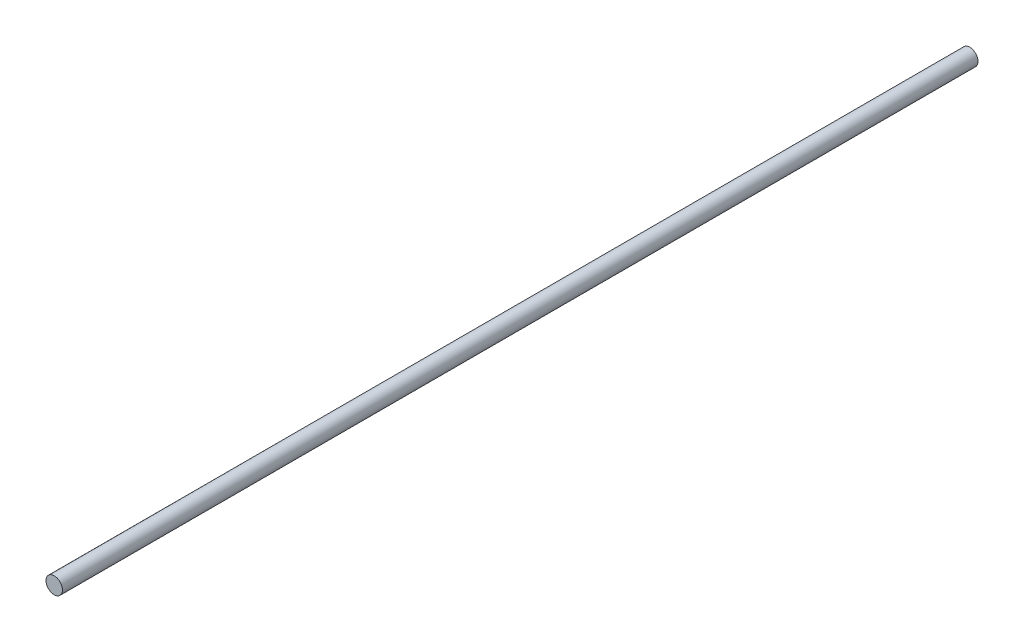
ISO-10303-21;
HEADER;
FILE_DESCRIPTION(('STEP AP214'),'2;1');
FILE_NAME('part.step','',(''),(''),'','','');
FILE_SCHEMA(('AUTOMOTIVE_DESIGN { 1 0 10303 214 1 1 1 1 }'));
ENDSEC;
DATA;
#1=APPLICATION_CONTEXT('core data for automotive mechanical design processes');
#2=APPLICATION_PROTOCOL_DEFINITION('international standard','automotive_design',2000,#1);
#3=PRODUCT_CONTEXT('',#1,'mechanical');
#4=PRODUCT('Part','Part','',(#3));
#5=PRODUCT_RELATED_PRODUCT_CATEGORY('part','',(#4));
#6=PRODUCT_DEFINITION_FORMATION('','',#4);
#7=PRODUCT_DEFINITION_CONTEXT('part definition',#1,'design');
#8=PRODUCT_DEFINITION('design','',#6,#7);
#9=PRODUCT_DEFINITION_SHAPE('','',#8);
#10=(LENGTH_UNIT() NAMED_UNIT(*) SI_UNIT(.MILLI.,.METRE.));
#11=(NAMED_UNIT(*) PLANE_ANGLE_UNIT() SI_UNIT($,.RADIAN.));
#12=(NAMED_UNIT(*) SI_UNIT($,.STERADIAN.) SOLID_ANGLE_UNIT());
#13=UNCERTAINTY_MEASURE_WITH_UNIT(LENGTH_MEASURE(1.E-05),#10,'distance_accuracy_value','');
#14=(GEOMETRIC_REPRESENTATION_CONTEXT(3) GLOBAL_UNCERTAINTY_ASSIGNED_CONTEXT((#13)) GLOBAL_UNIT_ASSIGNED_CONTEXT((#10,
#11,#12)) REPRESENTATION_CONTEXT('',''));
#15=CARTESIAN_POINT('',(0.,0.,0.));
#16=DIRECTION('',(0.,0.,1.));
#17=DIRECTION('',(1.,0.,0.));
#18=AXIS2_PLACEMENT_3D('',#15,#16,#17);
#19=CARTESIAN_POINT('',(0.,0.,445.));
#20=DIRECTION('',(0.,0.,-1.));
#21=DIRECTION('',(-1.,0.,0.));
#22=AXIS2_PLACEMENT_3D('',#19,#20,#21);
#23=CYLINDRICAL_SURFACE('',#22,4.);
#24=CARTESIAN_POINT('',(0.,0.,445.));
#25=DIRECTION('',(0.,0.,1.));
#26=DIRECTION('',(1.,0.,0.));
#27=AXIS2_PLACEMENT_3D('',#24,#25,#26);
#28=CIRCLE('',#27,4.);
#29=CARTESIAN_POINT('',(4.,0.,445.));
#30=VERTEX_POINT('',#29);
#31=EDGE_CURVE('E10',#30,#30,#28,.T.);
#32=ORIENTED_EDGE('',*,*,#31,.F.);
#33=EDGE_LOOP('',(#32));
#34=FACE_BOUND('',#33,.T.);
#35=CARTESIAN_POINT('',(0.,0.,0.));
#36=DIRECTION('',(0.,0.,1.));
#37=DIRECTION('',(1.,0.,0.));
#38=AXIS2_PLACEMENT_3D('',#35,#36,#37);
#39=CIRCLE('',#38,4.);
#40=CARTESIAN_POINT('',(4.,0.,0.));
#41=VERTEX_POINT('',#40);
#42=EDGE_CURVE('E38',#41,#41,#39,.T.);
#43=ORIENTED_EDGE('',*,*,#42,.T.);
#44=EDGE_LOOP('',(#43));
#45=FACE_BOUND('',#44,.T.);
#46=ADVANCED_FACE('F35',(#34,#45),#23,.T.);
#47=CARTESIAN_POINT('',(0.,0.,445.));
#48=DIRECTION('',(0.,0.,1.));
#49=DIRECTION('',(1.,0.,0.));
#50=AXIS2_PLACEMENT_3D('',#47,#48,#49);
#51=PLANE('',#50);
#52=ORIENTED_EDGE('',*,*,#31,.T.);
#53=EDGE_LOOP('',(#52));
#54=FACE_BOUND('',#53,.T.);
#55=ADVANCED_FACE('F50',(#54),#51,.T.);
#56=CARTESIAN_POINT('',(0.,0.,0.));
#57=DIRECTION('',(0.,0.,1.));
#58=DIRECTION('',(1.,0.,0.));
#59=AXIS2_PLACEMENT_3D('',#56,#57,#58);
#60=PLANE('',#59);
#61=ORIENTED_EDGE('',*,*,#42,.F.);
#62=EDGE_LOOP('',(#61));
#63=FACE_BOUND('',#62,.T.);
#64=ADVANCED_FACE('F48',(#63),#60,.F.);
#65=CLOSED_SHELL('',(#46,#55,#64));
#66=MANIFOLD_SOLID_BREP('B2',#65);
#67=ADVANCED_BREP_SHAPE_REPRESENTATION('',(#18,#66),#14);
#68=SHAPE_DEFINITION_REPRESENTATION(#9,#67);
ENDSEC;
END-ISO-10303-21;
